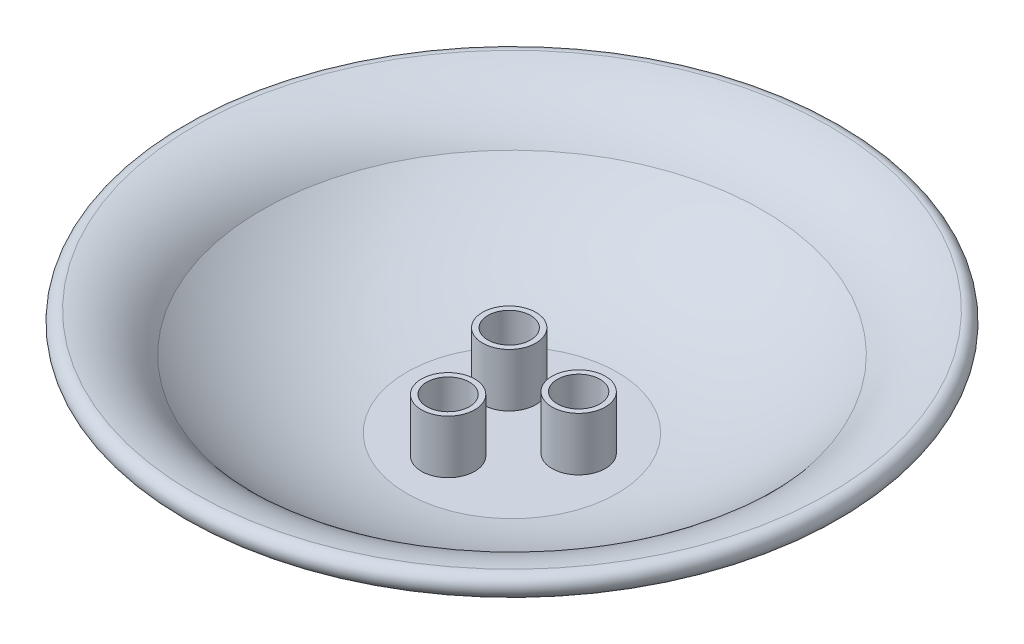
ISO-10303-21;
HEADER;
FILE_DESCRIPTION(('STEP AP214'),'2;1');
FILE_NAME('part.step','',(''),(''),'','','');
FILE_SCHEMA(('AUTOMOTIVE_DESIGN { 1 0 10303 214 1 1 1 1 }'));
ENDSEC;
DATA;
#1=APPLICATION_CONTEXT('core data for automotive mechanical design processes');
#2=APPLICATION_PROTOCOL_DEFINITION('international standard','automotive_design',2000,#1);
#3=PRODUCT_CONTEXT('',#1,'mechanical');
#4=PRODUCT('Part','Part','',(#3));
#5=PRODUCT_RELATED_PRODUCT_CATEGORY('part','',(#4));
#6=PRODUCT_DEFINITION_FORMATION('','',#4);
#7=PRODUCT_DEFINITION_CONTEXT('part definition',#1,'design');
#8=PRODUCT_DEFINITION('design','',#6,#7);
#9=PRODUCT_DEFINITION_SHAPE('','',#8);
#10=(LENGTH_UNIT() NAMED_UNIT(*) SI_UNIT(.MILLI.,.METRE.));
#11=(NAMED_UNIT(*) PLANE_ANGLE_UNIT() SI_UNIT($,.RADIAN.));
#12=(NAMED_UNIT(*) SI_UNIT($,.STERADIAN.) SOLID_ANGLE_UNIT());
#13=UNCERTAINTY_MEASURE_WITH_UNIT(LENGTH_MEASURE(1.E-05),#10,'distance_accuracy_value','');
#14=(GEOMETRIC_REPRESENTATION_CONTEXT(3) GLOBAL_UNCERTAINTY_ASSIGNED_CONTEXT((#13)) GLOBAL_UNIT_ASSIGNED_CONTEXT((#10,
#11,#12)) REPRESENTATION_CONTEXT('',''));
#15=CARTESIAN_POINT('',(0.,0.,0.));
#16=DIRECTION('',(0.,0.,1.));
#17=DIRECTION('',(1.,0.,0.));
#18=AXIS2_PLACEMENT_3D('',#15,#16,#17);
#19=CARTESIAN_POINT('',(13.1192660550459,6.17806077003984,0.));
#20=DIRECTION('',(0.,1.,0.));
#21=DIRECTION('',(0.,0.,1.));
#22=AXIS2_PLACEMENT_3D('',#19,#20,#21);
#23=TOROIDAL_SURFACE('',#22,29.8959735549191,1.);
#24=CARTESIAN_POINT('',(13.1192660550459,5.18348623853211,0.));
#25=DIRECTION('',(0.,1.,0.));
#26=DIRECTION('',(0.,0.,1.));
#27=AXIS2_PLACEMENT_3D('',#24,#25,#26);
#28=CIRCLE('',#27,30.);
#29=CARTESIAN_POINT('',(13.1192660550459,5.18348623853211,30.));
#30=VERTEX_POINT('',#29);
#31=EDGE_CURVE('E69',#30,#30,#28,.T.);
#32=ORIENTED_EDGE('',*,*,#31,.T.);
#33=EDGE_LOOP('',(#32));
#34=FACE_BOUND('',#33,.T.);
#35=CARTESIAN_POINT('',(13.1192660550459,7.17263530154758,0.));
#36=DIRECTION('',(0.,1.,0.));
#37=DIRECTION('',(0.,0.,1.));
#38=AXIS2_PLACEMENT_3D('',#35,#36,#37);
#39=CIRCLE('',#38,29.7919471098382);
#40=CARTESIAN_POINT('',(13.1192660550459,7.17263530154758,29.7919471098382));
#41=VERTEX_POINT('',#40);
#42=EDGE_CURVE('E52',#41,#41,#39,.T.);
#43=ORIENTED_EDGE('',*,*,#42,.F.);
#44=EDGE_LOOP('',(#43));
#45=FACE_BOUND('',#44,.T.);
#46=ADVANCED_FACE('F38',(#34,#45),#23,.T.);
#47=CARTESIAN_POINT('',(13.1192660550459,-1.67957037368538,0.));
#48=DIRECTION('',(0.,1.,0.));
#49=DIRECTION('',(0.,0.,1.));
#50=AXIS2_PLACEMENT_3D('',#47,#48,#49);
#51=TOROIDAL_SURFACE('',#50,30.7178339673305,8.90049503058699);
#52=ORIENTED_EDGE('',*,*,#42,.T.);
#53=EDGE_LOOP('',(#52));
#54=FACE_BOUND('',#53,.T.);
#55=CARTESIAN_POINT('',(13.1192660550459,3.51639603535897,0.));
#56=DIRECTION('',(0.,1.,0.));
#57=DIRECTION('',(0.,0.,1.));
#58=AXIS2_PLACEMENT_3D('',#55,#56,#57);
#59=CIRCLE('',#58,23.4914417232306);
#60=CARTESIAN_POINT('',(13.1192660550459,3.51639603535897,23.4914417232306));
#61=VERTEX_POINT('',#60);
#62=EDGE_CURVE('E57',#61,#61,#59,.T.);
#63=ORIENTED_EDGE('',*,*,#62,.F.);
#64=EDGE_LOOP('',(#63));
#65=FACE_BOUND('',#64,.T.);
#66=ADVANCED_FACE('F121',(#54,#65),#51,.T.);
#67=CARTESIAN_POINT('',(13.1192660550459,22.866819708958,0.));
#68=DIRECTION('',(0.,1.,0.));
#69=DIRECTION('',(0.,0.,1.));
#70=AXIS2_PLACEMENT_3D('',#67,#68,#69);
#71=DEGENERATE_TOROIDAL_SURFACE('',#70,6.21444438046789,25.9409624634402,.T.);
#72=ORIENTED_EDGE('',*,*,#62,.T.);
#73=EDGE_LOOP('',(#72));
#74=FACE_BOUND('',#73,.T.);
#75=CARTESIAN_POINT('',(13.1192660550459,-2.81651376146789,0.));
#76=DIRECTION('',(0.,1.,0.));
#77=DIRECTION('',(0.,0.,1.));
#78=AXIS2_PLACEMENT_3D('',#75,#76,#77);
#79=CIRCLE('',#78,9.86134928415182);
#80=CARTESIAN_POINT('',(13.1192660550459,-2.81651376146789,9.86134928415182));
#81=VERTEX_POINT('',#80);
#82=EDGE_CURVE('E60',#81,#81,#79,.T.);
#83=ORIENTED_EDGE('',*,*,#82,.F.);
#84=EDGE_LOOP('',(#83));
#85=FACE_BOUND('',#84,.T.);
#86=ADVANCED_FACE('F126',(#74,#85),#71,.F.);
#87=CARTESIAN_POINT('',(3.25791677089404,-2.81651376146789,0.));
#88=DIRECTION('',(0.,1.,0.));
#89=DIRECTION('',(0.,0.,1.));
#90=AXIS2_PLACEMENT_3D('',#87,#88,#89);
#91=PLANE('',#90);
#92=CARTESIAN_POINT('',(12.0041452804028,-2.81651376146789,4.87406459312548));
#93=DIRECTION('',(0.,1.,0.));
#94=DIRECTION('',(0.,0.,1.));
#95=AXIS2_PLACEMENT_3D('',#92,#93,#94);
#96=CIRCLE('',#95,2.5);
#97=CARTESIAN_POINT('',(12.0041452804028,-2.81651376146789,7.37406459312548));
#98=VERTEX_POINT('',#97);
#99=EDGE_CURVE('E91',#98,#98,#96,.T.);
#100=ORIENTED_EDGE('',*,*,#99,.F.);
#101=EDGE_LOOP('',(#100));
#102=FACE_BOUND('',#101,.T.);
#103=CARTESIAN_POINT('',(17.8978901997003,-2.81651376146789,-1.47130937743408));
#104=DIRECTION('',(0.,1.,0.));
#105=DIRECTION('',(0.,0.,1.));
#106=AXIS2_PLACEMENT_3D('',#103,#104,#105);
#107=CIRCLE('',#106,2.5);
#108=CARTESIAN_POINT('',(17.8978901997003,-2.81651376146789,1.02869062256592));
#109=VERTEX_POINT('',#108);
#110=EDGE_CURVE('E82',#109,#109,#107,.T.);
#111=ORIENTED_EDGE('',*,*,#110,.F.);
#112=EDGE_LOOP('',(#111));
#113=FACE_BOUND('',#112,.T.);
#114=CARTESIAN_POINT('',(9.45576268503444,-2.81651376146789,-3.40275521569139));
#115=DIRECTION('',(0.,1.,0.));
#116=DIRECTION('',(0.,0.,1.));
#117=AXIS2_PLACEMENT_3D('',#114,#115,#116);
#118=CIRCLE('',#117,2.5);
#119=CARTESIAN_POINT('',(9.45576268503444,-2.81651376146789,-0.902755215691387));
#120=VERTEX_POINT('',#119);
#121=EDGE_CURVE('E73',#120,#120,#118,.T.);
#122=ORIENTED_EDGE('',*,*,#121,.F.);
#123=EDGE_LOOP('',(#122));
#124=FACE_BOUND('',#123,.T.);
#125=ORIENTED_EDGE('',*,*,#82,.T.);
#126=EDGE_LOOP('',(#125));
#127=FACE_BOUND('',#126,.T.);
#128=ADVANCED_FACE('F136',(#102,#113,#124,#127),#91,.T.);
#129=CARTESIAN_POINT('',(3.11926605504587,-4.81651376146789,0.));
#130=DIRECTION('',(0.,-1.,0.));
#131=DIRECTION('',(0.,0.,-1.));
#132=AXIS2_PLACEMENT_3D('',#129,#130,#131);
#133=PLANE('',#132);
#134=CARTESIAN_POINT('',(13.1192660550459,-4.81651376146789,0.));
#135=DIRECTION('',(0.,1.,0.));
#136=DIRECTION('',(0.,0.,1.));
#137=AXIS2_PLACEMENT_3D('',#134,#135,#136);
#138=CIRCLE('',#137,9.99999999999998);
#139=CARTESIAN_POINT('',(13.1192660550459,-4.81651376146789,9.99999999999998));
#140=VERTEX_POINT('',#139);
#141=EDGE_CURVE('E63',#140,#140,#138,.T.);
#142=ORIENTED_EDGE('',*,*,#141,.F.);
#143=EDGE_LOOP('',(#142));
#144=FACE_BOUND('',#143,.T.);
#145=ADVANCED_FACE('F141',(#144),#133,.T.);
#146=CARTESIAN_POINT('',(13.1192660550459,22.866819708958,0.));
#147=DIRECTION('',(0.,1.,0.));
#148=DIRECTION('',(0.,0.,1.));
#149=AXIS2_PLACEMENT_3D('',#146,#147,#148);
#150=DEGENERATE_TOROIDAL_SURFACE('',#149,6.21444438046789,27.9409624634402,.T.);
#151=ORIENTED_EDGE('',*,*,#141,.T.);
#152=EDGE_LOOP('',(#151));
#153=FACE_BOUND('',#152,.T.);
#154=CARTESIAN_POINT('',(13.1192660550459,2.18348623853211,0.));
#155=DIRECTION('',(0.,1.,0.));
#156=DIRECTION('',(0.,0.,1.));
#157=AXIS2_PLACEMENT_3D('',#154,#155,#156);
#158=CIRCLE('',#157,25.);
#159=CARTESIAN_POINT('',(13.1192660550459,2.18348623853211,25.));
#160=VERTEX_POINT('',#159);
#161=EDGE_CURVE('E66',#160,#160,#158,.T.);
#162=ORIENTED_EDGE('',*,*,#161,.F.);
#163=EDGE_LOOP('',(#162));
#164=FACE_BOUND('',#163,.T.);
#165=ADVANCED_FACE('F146',(#153,#164),#150,.T.);
#166=CARTESIAN_POINT('',(13.1192660550459,-1.67957037368538,0.));
#167=DIRECTION('',(0.,1.,0.));
#168=DIRECTION('',(0.,0.,1.));
#169=AXIS2_PLACEMENT_3D('',#166,#167,#168);
#170=TOROIDAL_SURFACE('',#169,30.7178339673305,6.90049503058699);
#171=ORIENTED_EDGE('',*,*,#161,.T.);
#172=EDGE_LOOP('',(#171));
#173=FACE_BOUND('',#172,.T.);
#174=ORIENTED_EDGE('',*,*,#31,.F.);
#175=EDGE_LOOP('',(#174));
#176=FACE_BOUND('',#175,.T.);
#177=ADVANCED_FACE('F178',(#173,#176),#170,.F.);
#178=CARTESIAN_POINT('',(9.45576268503444,2.18348623853211,-3.40275521569139));
#179=DIRECTION('',(0.,1.,0.));
#180=DIRECTION('',(0.,0.,1.));
#181=AXIS2_PLACEMENT_3D('',#178,#179,#180);
#182=PLANE('',#181);
#183=CARTESIAN_POINT('',(9.45576268503444,2.18348623853211,-3.40275521569139));
#184=DIRECTION('',(0.,1.,0.));
#185=DIRECTION('',(0.,0.,1.));
#186=AXIS2_PLACEMENT_3D('',#183,#184,#185);
#187=CIRCLE('',#186,2.5);
#188=CARTESIAN_POINT('',(9.45576268503444,2.18348623853211,-0.902755215691387));
#189=VERTEX_POINT('',#188);
#190=EDGE_CURVE('E72',#189,#189,#187,.T.);
#191=ORIENTED_EDGE('',*,*,#190,.T.);
#192=EDGE_LOOP('',(#191));
#193=FACE_BOUND('',#192,.T.);
#194=CARTESIAN_POINT('',(9.45576268503444,2.18348623853211,-3.40275521569139));
#195=DIRECTION('',(0.,1.,0.));
#196=DIRECTION('',(0.,0.,1.));
#197=AXIS2_PLACEMENT_3D('',#194,#195,#196);
#198=CIRCLE('',#197,2.);
#199=CARTESIAN_POINT('',(9.45576268503444,2.18348623853211,-1.40275521569139));
#200=VERTEX_POINT('',#199);
#201=EDGE_CURVE('E76',#200,#200,#198,.T.);
#202=ORIENTED_EDGE('',*,*,#201,.F.);
#203=EDGE_LOOP('',(#202));
#204=FACE_BOUND('',#203,.T.);
#205=ADVANCED_FACE('F172',(#193,#204),#182,.T.);
#206=CARTESIAN_POINT('',(9.45576268503444,2.18348623853211,-3.40275521569139));
#207=DIRECTION('',(0.,-1.,0.));
#208=DIRECTION('',(0.,0.,-1.));
#209=AXIS2_PLACEMENT_3D('',#206,#207,#208);
#210=CYLINDRICAL_SURFACE('',#209,2.5);
#211=ORIENTED_EDGE('',*,*,#190,.F.);
#212=EDGE_LOOP('',(#211));
#213=FACE_BOUND('',#212,.T.);
#214=ORIENTED_EDGE('',*,*,#121,.T.);
#215=EDGE_LOOP('',(#214));
#216=FACE_BOUND('',#215,.T.);
#217=ADVANCED_FACE('F164',(#213,#216),#210,.T.);
#218=CARTESIAN_POINT('',(9.45576268503444,2.18348623853211,-3.40275521569139));
#219=DIRECTION('',(0.,-1.,0.));
#220=DIRECTION('',(0.,0.,-1.));
#221=AXIS2_PLACEMENT_3D('',#218,#219,#220);
#222=CYLINDRICAL_SURFACE('',#221,2.);
#223=ORIENTED_EDGE('',*,*,#201,.T.);
#224=EDGE_LOOP('',(#223));
#225=FACE_BOUND('',#224,.T.);
#226=CARTESIAN_POINT('',(9.45576268503444,-2.81651376146789,-3.40275521569139));
#227=DIRECTION('',(0.,1.,0.));
#228=DIRECTION('',(0.,0.,1.));
#229=AXIS2_PLACEMENT_3D('',#226,#227,#228);
#230=CIRCLE('',#229,2.);
#231=CARTESIAN_POINT('',(9.45576268503444,-2.81651376146789,-1.40275521569139));
#232=VERTEX_POINT('',#231);
#233=EDGE_CURVE('E48',#232,#232,#230,.F.);
#234=ORIENTED_EDGE('',*,*,#233,.T.);
#235=EDGE_LOOP('',(#234));
#236=FACE_BOUND('',#235,.T.);
#237=ADVANCED_FACE('F155',(#225,#236),#222,.F.);
#238=ORIENTED_EDGE('',*,*,#233,.F.);
#239=EDGE_LOOP('',(#238));
#240=FACE_BOUND('',#239,.T.);
#241=ADVANCED_FACE('F117',(#240),#91,.T.);
#242=CARTESIAN_POINT('',(17.8978901997003,2.18348623853211,-1.47130937743408));
#243=DIRECTION('',(0.,1.,0.));
#244=DIRECTION('',(0.,0.,1.));
#245=AXIS2_PLACEMENT_3D('',#242,#243,#244);
#246=PLANE('',#245);
#247=CARTESIAN_POINT('',(17.8978901997003,2.18348623853211,-1.47130937743408));
#248=DIRECTION('',(0.,1.,0.));
#249=DIRECTION('',(0.,0.,1.));
#250=AXIS2_PLACEMENT_3D('',#247,#248,#249);
#251=CIRCLE('',#250,2.5);
#252=CARTESIAN_POINT('',(17.8978901997003,2.18348623853211,1.02869062256592));
#253=VERTEX_POINT('',#252);
#254=EDGE_CURVE('E81',#253,#253,#251,.T.);
#255=ORIENTED_EDGE('',*,*,#254,.T.);
#256=EDGE_LOOP('',(#255));
#257=FACE_BOUND('',#256,.T.);
#258=CARTESIAN_POINT('',(17.8978901997003,2.18348623853211,-1.47130937743408));
#259=DIRECTION('',(0.,1.,0.));
#260=DIRECTION('',(0.,0.,1.));
#261=AXIS2_PLACEMENT_3D('',#258,#259,#260);
#262=CIRCLE('',#261,2.);
#263=CARTESIAN_POINT('',(17.8978901997003,2.18348623853211,0.528690622565919));
#264=VERTEX_POINT('',#263);
#265=EDGE_CURVE('E85',#264,#264,#262,.T.);
#266=ORIENTED_EDGE('',*,*,#265,.F.);
#267=EDGE_LOOP('',(#266));
#268=FACE_BOUND('',#267,.T.);
#269=ADVANCED_FACE('F154',(#257,#268),#246,.T.);
#270=CARTESIAN_POINT('',(17.8978901997003,2.18348623853211,-1.47130937743408));
#271=DIRECTION('',(0.,-1.,0.));
#272=DIRECTION('',(0.,0.,-1.));
#273=AXIS2_PLACEMENT_3D('',#270,#271,#272);
#274=CYLINDRICAL_SURFACE('',#273,2.5);
#275=ORIENTED_EDGE('',*,*,#254,.F.);
#276=EDGE_LOOP('',(#275));
#277=FACE_BOUND('',#276,.T.);
#278=ORIENTED_EDGE('',*,*,#110,.T.);
#279=EDGE_LOOP('',(#278));
#280=FACE_BOUND('',#279,.T.);
#281=ADVANCED_FACE('F161',(#277,#280),#274,.T.);
#282=CARTESIAN_POINT('',(17.8978901997003,2.18348623853211,-1.47130937743408));
#283=DIRECTION('',(0.,-1.,0.));
#284=DIRECTION('',(0.,0.,-1.));
#285=AXIS2_PLACEMENT_3D('',#282,#283,#284);
#286=CYLINDRICAL_SURFACE('',#285,2.);
#287=ORIENTED_EDGE('',*,*,#265,.T.);
#288=EDGE_LOOP('',(#287));
#289=FACE_BOUND('',#288,.T.);
#290=CARTESIAN_POINT('',(17.8978901997003,-2.81651376146789,-1.47130937743408));
#291=DIRECTION('',(0.,1.,0.));
#292=DIRECTION('',(0.,0.,1.));
#293=AXIS2_PLACEMENT_3D('',#290,#291,#292);
#294=CIRCLE('',#293,2.);
#295=CARTESIAN_POINT('',(17.8978901997003,-2.81651376146789,0.528690622565919));
#296=VERTEX_POINT('',#295);
#297=EDGE_CURVE('E44',#296,#296,#294,.F.);
#298=ORIENTED_EDGE('',*,*,#297,.T.);
#299=EDGE_LOOP('',(#298));
#300=FACE_BOUND('',#299,.T.);
#301=ADVANCED_FACE('F114',(#289,#300),#286,.F.);
#302=ORIENTED_EDGE('',*,*,#297,.F.);
#303=EDGE_LOOP('',(#302));
#304=FACE_BOUND('',#303,.T.);
#305=ADVANCED_FACE('F105',(#304),#91,.T.);
#306=CARTESIAN_POINT('',(12.0041452804028,2.18348623853211,4.87406459312548));
#307=DIRECTION('',(0.,1.,0.));
#308=DIRECTION('',(0.,0.,1.));
#309=AXIS2_PLACEMENT_3D('',#306,#307,#308);
#310=PLANE('',#309);
#311=CARTESIAN_POINT('',(12.0041452804028,2.18348623853211,4.87406459312548));
#312=DIRECTION('',(0.,1.,0.));
#313=DIRECTION('',(0.,0.,1.));
#314=AXIS2_PLACEMENT_3D('',#311,#312,#313);
#315=CIRCLE('',#314,2.5);
#316=CARTESIAN_POINT('',(12.0041452804028,2.18348623853211,7.37406459312548));
#317=VERTEX_POINT('',#316);
#318=EDGE_CURVE('E90',#317,#317,#315,.T.);
#319=ORIENTED_EDGE('',*,*,#318,.T.);
#320=EDGE_LOOP('',(#319));
#321=FACE_BOUND('',#320,.T.);
#322=CARTESIAN_POINT('',(12.0041452804028,2.18348623853211,4.87406459312548));
#323=DIRECTION('',(0.,1.,0.));
#324=DIRECTION('',(0.,0.,1.));
#325=AXIS2_PLACEMENT_3D('',#322,#323,#324);
#326=CIRCLE('',#325,2.);
#327=CARTESIAN_POINT('',(12.0041452804028,2.18348623853211,6.87406459312548));
#328=VERTEX_POINT('',#327);
#329=EDGE_CURVE('E94',#328,#328,#326,.T.);
#330=ORIENTED_EDGE('',*,*,#329,.F.);
#331=EDGE_LOOP('',(#330));
#332=FACE_BOUND('',#331,.T.);
#333=ADVANCED_FACE('F102',(#321,#332),#310,.T.);
#334=CARTESIAN_POINT('',(12.0041452804028,2.18348623853211,4.87406459312548));
#335=DIRECTION('',(0.,-1.,0.));
#336=DIRECTION('',(0.,0.,-1.));
#337=AXIS2_PLACEMENT_3D('',#334,#335,#336);
#338=CYLINDRICAL_SURFACE('',#337,2.5);
#339=ORIENTED_EDGE('',*,*,#318,.F.);
#340=EDGE_LOOP('',(#339));
#341=FACE_BOUND('',#340,.T.);
#342=ORIENTED_EDGE('',*,*,#99,.T.);
#343=EDGE_LOOP('',(#342));
#344=FACE_BOUND('',#343,.T.);
#345=ADVANCED_FACE('F104',(#341,#344),#338,.T.);
#346=CARTESIAN_POINT('',(12.0041452804028,2.18348623853211,4.87406459312548));
#347=DIRECTION('',(0.,-1.,0.));
#348=DIRECTION('',(0.,0.,-1.));
#349=AXIS2_PLACEMENT_3D('',#346,#347,#348);
#350=CYLINDRICAL_SURFACE('',#349,2.);
#351=ORIENTED_EDGE('',*,*,#329,.T.);
#352=EDGE_LOOP('',(#351));
#353=FACE_BOUND('',#352,.T.);
#354=CARTESIAN_POINT('',(12.0041452804028,-2.81651376146789,4.87406459312548));
#355=DIRECTION('',(0.,1.,0.));
#356=DIRECTION('',(0.,0.,1.));
#357=AXIS2_PLACEMENT_3D('',#354,#355,#356);
#358=CIRCLE('',#357,2.);
#359=CARTESIAN_POINT('',(12.0041452804028,-2.81651376146789,6.87406459312548));
#360=VERTEX_POINT('',#359);
#361=EDGE_CURVE('E10',#360,#360,#358,.F.);
#362=ORIENTED_EDGE('',*,*,#361,.T.);
#363=EDGE_LOOP('',(#362));
#364=FACE_BOUND('',#363,.T.);
#365=ADVANCED_FACE('F100',(#353,#364),#350,.F.);
#366=ORIENTED_EDGE('',*,*,#361,.F.);
#367=EDGE_LOOP('',(#366));
#368=FACE_BOUND('',#367,.T.);
#369=ADVANCED_FACE('F118',(#368),#91,.T.);
#370=CLOSED_SHELL('',(#46,#66,#86,#128,#145,#165,#177,#205,#217,#237,#241,#269,#281,#301,#305,
#333,#345,#365,#369));
#371=MANIFOLD_SOLID_BREP('B2',#370);
#372=ADVANCED_BREP_SHAPE_REPRESENTATION('',(#18,#371),#14);
#373=SHAPE_DEFINITION_REPRESENTATION(#9,#372);
ENDSEC;
END-ISO-10303-21;
